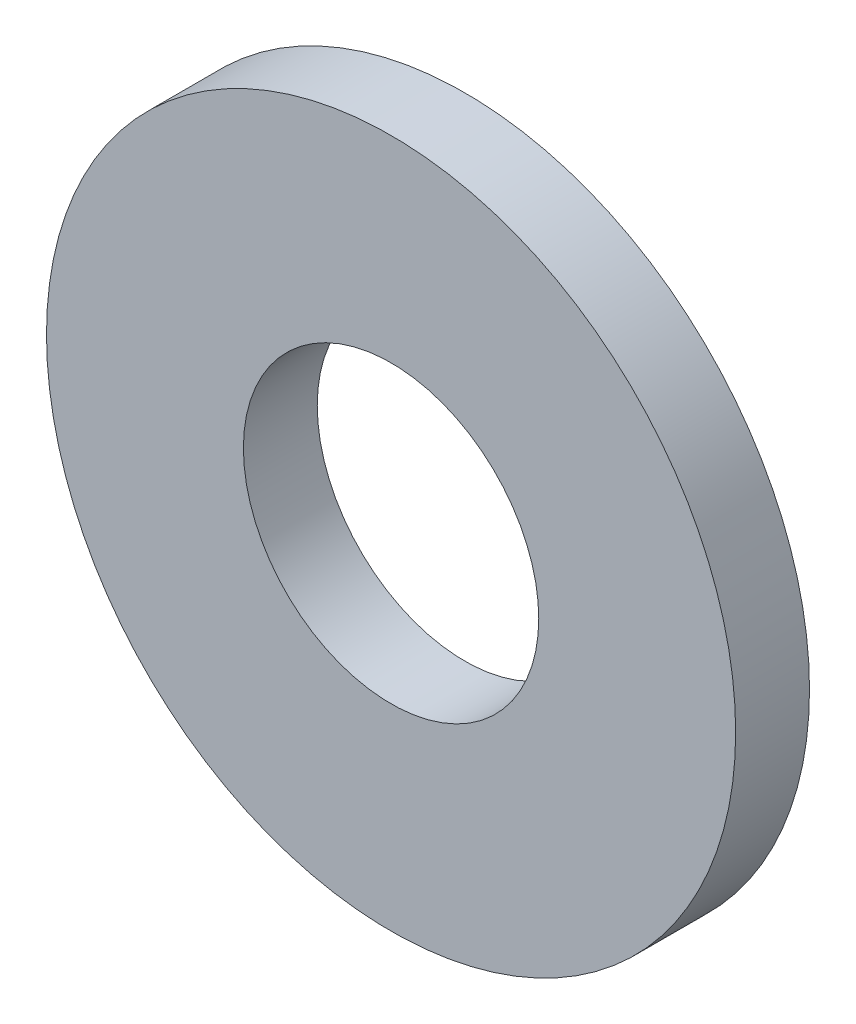
ISO-10303-21;
HEADER;
FILE_DESCRIPTION(('STEP AP214'),'2;1');
FILE_NAME('part.step','',(''),(''),'','','');
FILE_SCHEMA(('AUTOMOTIVE_DESIGN { 1 0 10303 214 1 1 1 1 }'));
ENDSEC;
DATA;
#1=APPLICATION_CONTEXT('core data for automotive mechanical design processes');
#2=APPLICATION_PROTOCOL_DEFINITION('international standard','automotive_design',2000,#1);
#3=PRODUCT_CONTEXT('',#1,'mechanical');
#4=PRODUCT('Part','Part','',(#3));
#5=PRODUCT_RELATED_PRODUCT_CATEGORY('part','',(#4));
#6=PRODUCT_DEFINITION_FORMATION('','',#4);
#7=PRODUCT_DEFINITION_CONTEXT('part definition',#1,'design');
#8=PRODUCT_DEFINITION('design','',#6,#7);
#9=PRODUCT_DEFINITION_SHAPE('','',#8);
#10=(LENGTH_UNIT() NAMED_UNIT(*) SI_UNIT(.MILLI.,.METRE.));
#11=(NAMED_UNIT(*) PLANE_ANGLE_UNIT() SI_UNIT($,.RADIAN.));
#12=(NAMED_UNIT(*) SI_UNIT($,.STERADIAN.) SOLID_ANGLE_UNIT());
#13=UNCERTAINTY_MEASURE_WITH_UNIT(LENGTH_MEASURE(1.E-05),#10,'distance_accuracy_value','');
#14=(GEOMETRIC_REPRESENTATION_CONTEXT(3) GLOBAL_UNCERTAINTY_ASSIGNED_CONTEXT((#13)) GLOBAL_UNIT_ASSIGNED_CONTEXT((#10,
#11,#12)) REPRESENTATION_CONTEXT('',''));
#15=CARTESIAN_POINT('',(0.,0.,0.));
#16=DIRECTION('',(0.,0.,1.));
#17=DIRECTION('',(1.,0.,0.));
#18=AXIS2_PLACEMENT_3D('',#15,#16,#17);
#19=CARTESIAN_POINT('',(0.,0.,1.5));
#20=DIRECTION('',(0.,0.,1.));
#21=DIRECTION('',(1.,0.,0.));
#22=AXIS2_PLACEMENT_3D('',#19,#20,#21);
#23=PLANE('',#22);
#24=CARTESIAN_POINT('',(0.,0.,1.5));
#25=DIRECTION('',(0.,0.,1.));
#26=DIRECTION('',(1.,0.,0.));
#27=AXIS2_PLACEMENT_3D('',#24,#25,#26);
#28=CIRCLE('',#27,7.);
#29=CARTESIAN_POINT('',(7.,0.,1.5));
#30=VERTEX_POINT('',#29);
#31=EDGE_CURVE('E10',#30,#30,#28,.T.);
#32=ORIENTED_EDGE('',*,*,#31,.T.);
#33=EDGE_LOOP('',(#32));
#34=FACE_BOUND('',#33,.T.);
#35=CARTESIAN_POINT('',(0.,0.,1.5));
#36=DIRECTION('',(0.,0.,1.));
#37=DIRECTION('',(1.,0.,0.));
#38=AXIS2_PLACEMENT_3D('',#35,#36,#37);
#39=CIRCLE('',#38,3.);
#40=CARTESIAN_POINT('',(3.,0.,1.5));
#41=VERTEX_POINT('',#40);
#42=EDGE_CURVE('E40',#41,#41,#39,.T.);
#43=ORIENTED_EDGE('',*,*,#42,.F.);
#44=EDGE_LOOP('',(#43));
#45=FACE_BOUND('',#44,.T.);
#46=ADVANCED_FACE('F29',(#34,#45),#23,.T.);
#47=CARTESIAN_POINT('',(0.,0.,0.));
#48=DIRECTION('',(0.,0.,1.));
#49=DIRECTION('',(1.,0.,0.));
#50=AXIS2_PLACEMENT_3D('',#47,#48,#49);
#51=PLANE('',#50);
#52=CARTESIAN_POINT('',(0.,0.,0.));
#53=DIRECTION('',(0.,0.,1.));
#54=DIRECTION('',(1.,0.,0.));
#55=AXIS2_PLACEMENT_3D('',#52,#53,#54);
#56=CIRCLE('',#55,7.);
#57=CARTESIAN_POINT('',(7.,0.,0.));
#58=VERTEX_POINT('',#57);
#59=EDGE_CURVE('E33',#58,#58,#56,.T.);
#60=ORIENTED_EDGE('',*,*,#59,.F.);
#61=EDGE_LOOP('',(#60));
#62=FACE_BOUND('',#61,.T.);
#63=CARTESIAN_POINT('',(0.,0.,0.));
#64=DIRECTION('',(0.,0.,1.));
#65=DIRECTION('',(1.,0.,0.));
#66=AXIS2_PLACEMENT_3D('',#63,#64,#65);
#67=CIRCLE('',#66,3.);
#68=CARTESIAN_POINT('',(3.,0.,0.));
#69=VERTEX_POINT('',#68);
#70=EDGE_CURVE('E42',#69,#69,#67,.T.);
#71=ORIENTED_EDGE('',*,*,#70,.T.);
#72=EDGE_LOOP('',(#71));
#73=FACE_BOUND('',#72,.T.);
#74=ADVANCED_FACE('F52',(#62,#73),#51,.F.);
#75=CARTESIAN_POINT('',(0.,0.,1.5));
#76=DIRECTION('',(0.,0.,-1.));
#77=DIRECTION('',(-1.,0.,0.));
#78=AXIS2_PLACEMENT_3D('',#75,#76,#77);
#79=CYLINDRICAL_SURFACE('',#78,7.);
#80=ORIENTED_EDGE('',*,*,#31,.F.);
#81=EDGE_LOOP('',(#80));
#82=FACE_BOUND('',#81,.T.);
#83=ORIENTED_EDGE('',*,*,#59,.T.);
#84=EDGE_LOOP('',(#83));
#85=FACE_BOUND('',#84,.T.);
#86=ADVANCED_FACE('F31',(#82,#85),#79,.T.);
#87=CARTESIAN_POINT('',(0.,0.,1.5));
#88=DIRECTION('',(0.,0.,-1.));
#89=DIRECTION('',(-1.,0.,0.));
#90=AXIS2_PLACEMENT_3D('',#87,#88,#89);
#91=CYLINDRICAL_SURFACE('',#90,3.);
#92=ORIENTED_EDGE('',*,*,#42,.T.);
#93=EDGE_LOOP('',(#92));
#94=FACE_BOUND('',#93,.T.);
#95=ORIENTED_EDGE('',*,*,#70,.F.);
#96=EDGE_LOOP('',(#95));
#97=FACE_BOUND('',#96,.T.);
#98=ADVANCED_FACE('F48',(#94,#97),#91,.F.);
#99=CLOSED_SHELL('',(#46,#74,#86,#98));
#100=MANIFOLD_SOLID_BREP('B2',#99);
#101=ADVANCED_BREP_SHAPE_REPRESENTATION('',(#18,#100),#14);
#102=SHAPE_DEFINITION_REPRESENTATION(#9,#101);
ENDSEC;
END-ISO-10303-21;
